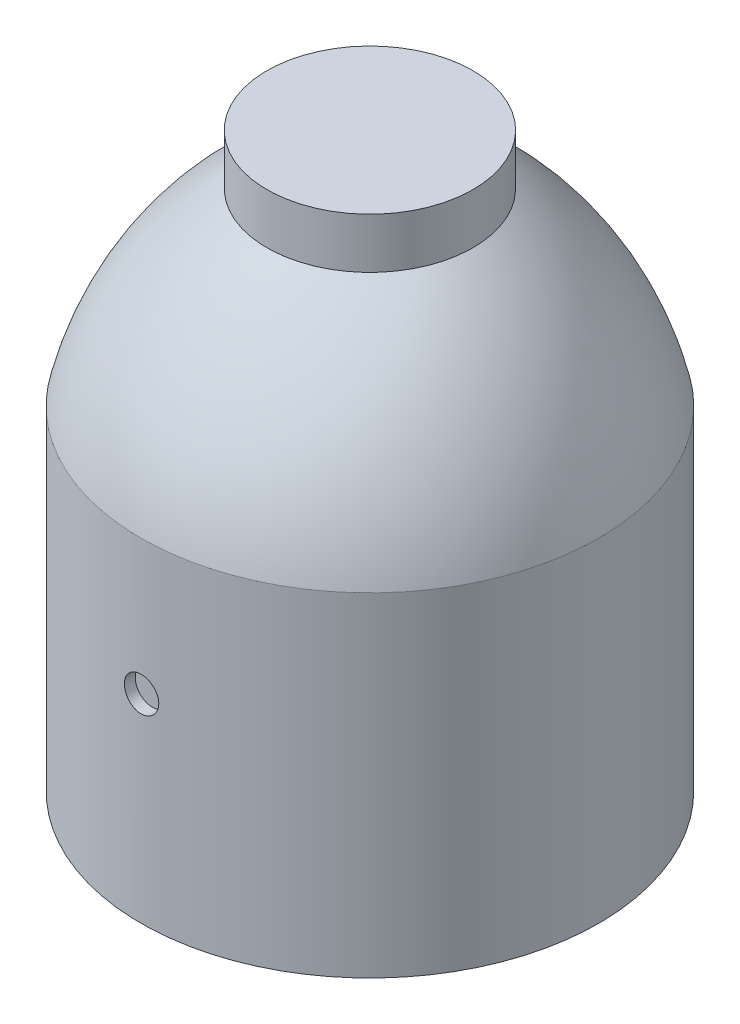
ISO-10303-21;
HEADER;
FILE_DESCRIPTION(('STEP AP214'),'2;1');
FILE_NAME('part.step','',(''),(''),'','','');
FILE_SCHEMA(('AUTOMOTIVE_DESIGN { 1 0 10303 214 1 1 1 1 }'));
ENDSEC;
DATA;
#1=APPLICATION_CONTEXT('core data for automotive mechanical design processes');
#2=APPLICATION_PROTOCOL_DEFINITION('international standard','automotive_design',2000,#1);
#3=PRODUCT_CONTEXT('',#1,'mechanical');
#4=PRODUCT('Part','Part','',(#3));
#5=PRODUCT_RELATED_PRODUCT_CATEGORY('part','',(#4));
#6=PRODUCT_DEFINITION_FORMATION('','',#4);
#7=PRODUCT_DEFINITION_CONTEXT('part definition',#1,'design');
#8=PRODUCT_DEFINITION('design','',#6,#7);
#9=PRODUCT_DEFINITION_SHAPE('','',#8);
#10=(LENGTH_UNIT() NAMED_UNIT(*) SI_UNIT(.MILLI.,.METRE.));
#11=(NAMED_UNIT(*) PLANE_ANGLE_UNIT() SI_UNIT($,.RADIAN.));
#12=(NAMED_UNIT(*) SI_UNIT($,.STERADIAN.) SOLID_ANGLE_UNIT());
#13=UNCERTAINTY_MEASURE_WITH_UNIT(LENGTH_MEASURE(1.E-05),#10,'distance_accuracy_value','');
#14=(GEOMETRIC_REPRESENTATION_CONTEXT(3) GLOBAL_UNCERTAINTY_ASSIGNED_CONTEXT((#13)) GLOBAL_UNIT_ASSIGNED_CONTEXT((#10,
#11,#12)) REPRESENTATION_CONTEXT('',''));
#15=CARTESIAN_POINT('',(0.,0.,0.));
#16=DIRECTION('',(0.,0.,1.));
#17=DIRECTION('',(1.,0.,0.));
#18=AXIS2_PLACEMENT_3D('',#15,#16,#17);
#19=CARTESIAN_POINT('',(7.83466695020169,43.9726716840758,0.));
#20=DIRECTION('',(0.,-1.,0.));
#21=DIRECTION('',(0.,0.,-1.));
#22=AXIS2_PLACEMENT_3D('',#19,#20,#21);
#23=PLANE('',#22);
#24=CARTESIAN_POINT('',(0.,43.9726716840758,0.));
#25=DIRECTION('',(0.,-1.,0.));
#26=DIRECTION('',(0.,0.,-1.));
#27=AXIS2_PLACEMENT_3D('',#24,#25,#26);
#28=CIRCLE('',#27,7.83466695020169);
#29=CARTESIAN_POINT('',(0.,43.9726716840758,-7.83466695020169));
#30=VERTEX_POINT('',#29);
#31=EDGE_CURVE('E43',#30,#30,#28,.T.);
#32=ORIENTED_EDGE('',*,*,#31,.T.);
#33=EDGE_LOOP('',(#32));
#34=FACE_BOUND('',#33,.T.);
#35=ADVANCED_FACE('F33',(#34),#23,.T.);
#36=CARTESIAN_POINT('',(0.,22.7406076347395,0.));
#37=DIRECTION('',(0.,-1.,0.));
#38=DIRECTION('',(0.,0.,-1.));
#39=AXIS2_PLACEMENT_3D('',#36,#37,#38);
#40=DEGENERATE_TOROIDAL_SURFACE('',#39,7.38748189935041,26.124975777846,.F.);
#41=CARTESIAN_POINT('',(0.,28.9042203905179,0.));
#42=DIRECTION('',(0.,-1.,0.));
#43=DIRECTION('',(0.,0.,-1.));
#44=AXIS2_PLACEMENT_3D('',#41,#42,#43);
#45=CIRCLE('',#44,18.);
#46=CARTESIAN_POINT('',(0.,28.9042203905179,-18.));
#47=VERTEX_POINT('',#46);
#48=EDGE_CURVE('E47',#47,#47,#45,.T.);
#49=ORIENTED_EDGE('',*,*,#48,.T.);
#50=EDGE_LOOP('',(#49));
#51=FACE_BOUND('',#50,.T.);
#52=ORIENTED_EDGE('',*,*,#31,.F.);
#53=EDGE_LOOP('',(#52));
#54=FACE_BOUND('',#53,.T.);
#55=ADVANCED_FACE('F87',(#51,#54),#40,.T.);
#56=CARTESIAN_POINT('',(0.,0.,0.));
#57=DIRECTION('',(0.,-1.,0.));
#58=DIRECTION('',(0.,0.,-1.));
#59=AXIS2_PLACEMENT_3D('',#56,#57,#58);
#60=CYLINDRICAL_SURFACE('',#59,18.);
#61=CARTESIAN_POINT('',(0.,0.,0.));
#62=DIRECTION('',(0.,-1.,0.));
#63=DIRECTION('',(0.,0.,-1.));
#64=AXIS2_PLACEMENT_3D('',#61,#62,#63);
#65=CIRCLE('',#64,18.);
#66=CARTESIAN_POINT('',(0.,0.,-18.));
#67=VERTEX_POINT('',#66);
#68=EDGE_CURVE('E51',#67,#67,#65,.T.);
#69=ORIENTED_EDGE('',*,*,#68,.T.);
#70=EDGE_LOOP('',(#69));
#71=FACE_BOUND('',#70,.T.);
#72=ORIENTED_EDGE('',*,*,#48,.F.);
#73=EDGE_LOOP('',(#72));
#74=FACE_BOUND('',#73,.T.);
#75=ADVANCED_FACE('F91',(#71,#74),#60,.F.);
#76=CARTESIAN_POINT('',(20.,0.,0.));
#77=DIRECTION('',(0.,-1.,0.));
#78=DIRECTION('',(0.,0.,-1.));
#79=AXIS2_PLACEMENT_3D('',#76,#77,#78);
#80=PLANE('',#79);
#81=CARTESIAN_POINT('',(0.,0.,0.));
#82=DIRECTION('',(0.,-1.,0.));
#83=DIRECTION('',(0.,0.,-1.));
#84=AXIS2_PLACEMENT_3D('',#81,#82,#83);
#85=CIRCLE('',#84,20.);
#86=CARTESIAN_POINT('',(0.,0.,-20.));
#87=VERTEX_POINT('',#86);
#88=EDGE_CURVE('E56',#87,#87,#85,.T.);
#89=ORIENTED_EDGE('',*,*,#88,.T.);
#90=EDGE_LOOP('',(#89));
#91=FACE_BOUND('',#90,.T.);
#92=ORIENTED_EDGE('',*,*,#68,.F.);
#93=EDGE_LOOP('',(#92));
#94=FACE_BOUND('',#93,.T.);
#95=ADVANCED_FACE('F96',(#91,#94),#80,.T.);
#96=CARTESIAN_POINT('',(0.,0.,0.));
#97=DIRECTION('',(0.,-1.,0.));
#98=DIRECTION('',(0.,0.,-1.));
#99=AXIS2_PLACEMENT_3D('',#96,#97,#98);
#100=CYLINDRICAL_SURFACE('',#99,20.);
#101=CARTESIAN_POINT('',(1.5,17.3473663975393,19.9436706751791));
#102=CARTESIAN_POINT('',(1.49999631284401,17.4314948318172,19.9436714247109));
#103=CARTESIAN_POINT('',(1.49289860739439,17.5156812493339,19.9442087219975));
#104=CARTESIAN_POINT('',(1.46468784137981,17.6817268131872,19.9462999542358));
#105=CARTESIAN_POINT('',(1.44355871231829,17.7635831789873,19.9478550547254));
#106=CARTESIAN_POINT('',(1.38789779324919,17.9225395809697,19.9518047691616));
#107=CARTESIAN_POINT('',(1.3533733740953,17.9996422059385,19.9541989213442));
#108=CARTESIAN_POINT('',(1.27191450979852,18.1469389029969,19.9595563959789));
#109=CARTESIAN_POINT('',(1.22498279950199,18.2171344928796,19.9625195929615));
#110=CARTESIAN_POINT('',(1.11993432781423,18.348791421323,19.9686882981736));
#111=CARTESIAN_POINT('',(1.06179688800529,18.4102362414351,19.9718942476191));
#112=CARTESIAN_POINT('',(0.93603067250677,18.522505722187,19.9781831621206));
#113=CARTESIAN_POINT('',(0.868401490593041,18.5733299280579,19.9812661219056));
#114=CARTESIAN_POINT('',(0.725474871268799,18.662968949624,19.9869657395593));
#115=CARTESIAN_POINT('',(0.650168585461499,18.7017696946339,19.9895818495818));
#116=CARTESIAN_POINT('',(0.49408728515665,18.7661703596598,19.9940482820627));
#117=CARTESIAN_POINT('',(0.413312350227829,18.791770471698,19.9958986156604));
#118=CARTESIAN_POINT('',(0.24874925036704,18.8289962368438,19.9986219399733));
#119=CARTESIAN_POINT('',(0.164967095353705,18.8406483205173,19.9994967789682));
#120=CARTESIAN_POINT('',(-0.00336809130426481,18.8497289397635,20.0001767917244));
#121=CARTESIAN_POINT('',(-0.0879211110423922,18.8471576946544,19.9999819819791));
#122=CARTESIAN_POINT('',(-0.255218748149912,18.8278863366852,19.9985461791421));
#123=CARTESIAN_POINT('',(-0.337966660410974,18.8112146486972,19.9973072908106));
#124=CARTESIAN_POINT('',(-0.499486291412522,18.7642598136409,19.9939251552444));
#125=CARTESIAN_POINT('',(-0.578257978464621,18.7339765581147,19.9917819008036));
#126=CARTESIAN_POINT('',(-0.72967992384892,18.660626317356,19.9868286111045));
#127=CARTESIAN_POINT('',(-0.802323960991477,18.6175465361483,19.9840179089941));
#128=CARTESIAN_POINT('',(-0.939360594503045,18.5198354169471,19.978045787876));
#129=CARTESIAN_POINT('',(-1.00375305579813,18.4652038898962,19.9748843631288));
#130=CARTESIAN_POINT('',(-1.12262474222923,18.3457797178819,19.9685571200843));
#131=CARTESIAN_POINT('',(-1.17707916883749,18.2809623856234,19.9653913101349));
#132=CARTESIAN_POINT('',(-1.27433760665748,18.1430927602105,19.959419970567));
#133=CARTESIAN_POINT('',(-1.31714161069999,18.0700404619887,19.9566144411701));
#134=CARTESIAN_POINT('',(-1.38988285490415,17.9177578931645,19.9516806682916));
#135=CARTESIAN_POINT('',(-1.4198189134728,17.8385270560096,19.9495524870119));
#136=CARTESIAN_POINT('',(-1.46595667179795,17.67614431693,19.9462154499794));
#137=CARTESIAN_POINT('',(-1.48215860485201,17.5929924816355,19.9450065786106));
#138=CARTESIAN_POINT('',(-1.50033702209464,17.4253448206318,19.9436474451507));
#139=CARTESIAN_POINT('',(-1.50234804014615,17.3408527594478,19.9434946131863));
#140=CARTESIAN_POINT('',(-1.49217790233958,17.1727326376888,19.9442580734706));
#141=CARTESIAN_POINT('',(-1.47999685337437,17.0891045706112,19.9451743576668));
#142=CARTESIAN_POINT('',(-1.44181710169969,16.925184824183,19.9479704572233));
#143=CARTESIAN_POINT('',(-1.41583442327885,16.8448893918236,19.9498491550899));
#144=CARTESIAN_POINT('',(-1.35080522878804,16.6897981301655,19.9543574532934));
#145=CARTESIAN_POINT('',(-1.31175854243361,16.6150023725686,19.9569870634181));
#146=CARTESIAN_POINT('',(-1.2216219631562,16.472875344982,19.9627071136634));
#147=CARTESIAN_POINT('',(-1.17050900238948,16.4055587404373,19.9657984322502));
#148=CARTESIAN_POINT('',(-1.05772421033485,16.2804488992959,19.9720905549617));
#149=CARTESIAN_POINT('',(-0.996052231484174,16.2226557958127,19.975291360616));
#150=CARTESIAN_POINT('',(-0.863751071664403,16.1181161454315,19.9814493930731));
#151=CARTESIAN_POINT('',(-0.793104165808337,16.0713919968453,19.9844061182321));
#152=CARTESIAN_POINT('',(-0.644947221990192,15.9904700824454,19.9897356262579));
#153=CARTESIAN_POINT('',(-0.56743724133021,15.9562722120579,19.9921084139996));
#154=CARTESIAN_POINT('',(-0.407835533992325,15.9014122891843,19.9960003563777));
#155=CARTESIAN_POINT('',(-0.325748638943226,15.8807362453301,19.9975203931443));
#156=CARTESIAN_POINT('',(-0.159256592820331,15.8534611378392,19.9995391228448));
#157=CARTESIAN_POINT('',(-0.0748514764856431,15.8468618633752,20.0000378310751));
#158=CARTESIAN_POINT('',(0.0936599022297128,15.8479298847501,19.9999577474694));
#159=CARTESIAN_POINT('',(0.177766389716277,15.8555622121031,19.999381596669));
#160=CARTESIAN_POINT('',(0.343499701494934,15.8848040413708,19.9972217798986));
#161=CARTESIAN_POINT('',(0.42512652193554,15.9064135649942,19.9956381123638));
#162=CARTESIAN_POINT('',(0.583586891968922,15.9629878780826,19.9916410805027));
#163=CARTESIAN_POINT('',(0.660420597981289,15.9979522314576,19.989227743269));
#164=CARTESIAN_POINT('',(0.807132637033066,16.0802394302928,19.9838417849228));
#165=CARTESIAN_POINT('',(0.877011110424922,16.1275620263011,19.9808691750997));
#166=CARTESIAN_POINT('',(1.0080076253239,16.2333532082976,19.9746899428358));
#167=CARTESIAN_POINT('',(1.0691048813846,16.2918475006511,19.9714827914222));
#168=CARTESIAN_POINT('',(1.18063663968307,16.4182787620678,19.9652003844937));
#169=CARTESIAN_POINT('',(1.23106854462047,16.4862180245749,19.9621251612519));
#170=CARTESIAN_POINT('',(1.3198926494262,16.6297187058213,19.9564494251809));
#171=CARTESIAN_POINT('',(1.35826551818871,16.7052921087428,19.9538496773175));
#172=CARTESIAN_POINT('',(1.42172936312997,16.861775626475,19.9494287405787));
#173=CARTESIAN_POINT('',(1.44683573384081,16.9426794326416,19.9476066497794));
#174=CARTESIAN_POINT('',(1.47660249533122,17.0779513826942,19.9454198272495));
#175=CARTESIAN_POINT('',(1.48536503492031,17.1314475275407,19.9447668737592));
#176=CARTESIAN_POINT('',(1.49706496792379,17.2390765721958,19.9438920569245));
#177=CARTESIAN_POINT('',(1.50000237357368,17.2932094706668,19.9436701926747));
#178=CARTESIAN_POINT('',(1.5,17.3473663975393,19.9436706751791));
#179=B_SPLINE_CURVE_WITH_KNOTS('',3,(#101,#102,#103,#104,#105,#106,#107,#108,#109,#110,#111,
#112,#113,#114,#115,#116,#117,#118,#119,#120,#121,#122,#123,#124,#125,#126,#127,#128,#129,#130,
#131,#132,#133,#134,#135,#136,#137,#138,#139,#140,#141,#142,#143,#144,#145,#146,#147,#148,#149,
#150,#151,#152,#153,#154,#155,#156,#157,#158,#159,#160,#161,#162,#163,#164,#165,#166,#167,#168,
#169,#170,#171,#172,#173,#174,#175,#176,#177,#178),.UNSPECIFIED.,.T.,.F.,(4,2,2,2,2,2,2,2,2,2,2,
2,2,2,2,2,2,2,2,2,2,2,2,2,2,2,2,2,2,2,2,2,2,2,2,2,2,2,4),(0.,0.252187579339044,
0.504664457860796,0.757002605762189,1.00928517896143,1.26203783609002,1.5148013137358,
1.76785948521025,2.02091397548468,2.2734881817416,2.52605849341277,2.7781208625958,
3.03018524026398,3.28250252487075,3.53482393925043,3.7877666140638,4.04070944452772,
4.2936754963882,4.54663725110237,4.79898320559482,5.0513272594613,5.30337896930957,
5.55543396468601,5.80797478825659,6.06051914138529,6.31357024084872,6.5666192277034,
6.8194059624945,7.07218891127966,7.32435156508922,7.57651461054472,7.82866942254426,
8.08081914517807,8.3335562178414,8.58635476809665,8.83955652118654,9.09246380844972,
9.25480764733516,9.41715114522215),.UNSPECIFIED.);
#180=CARTESIAN_POINT('',(1.5,17.3473663975393,19.9436706751791));
#181=VERTEX_POINT('',#180);
#182=EDGE_CURVE('E10',#181,#181,#179,.T.);
#183=ORIENTED_EDGE('',*,*,#182,.F.);
#184=EDGE_LOOP('',(#183));
#185=FACE_BOUND('',#184,.T.);
#186=CARTESIAN_POINT('',(0.,29.1390525799724,0.));
#187=DIRECTION('',(0.,-1.,0.));
#188=DIRECTION('',(0.,0.,-1.));
#189=AXIS2_PLACEMENT_3D('',#186,#187,#188);
#190=CIRCLE('',#189,20.);
#191=CARTESIAN_POINT('',(0.,29.1390525799724,-20.));
#192=VERTEX_POINT('',#191);
#193=EDGE_CURVE('E59',#192,#192,#190,.T.);
#194=ORIENTED_EDGE('',*,*,#193,.T.);
#195=EDGE_LOOP('',(#194));
#196=FACE_BOUND('',#195,.T.);
#197=ORIENTED_EDGE('',*,*,#88,.F.);
#198=EDGE_LOOP('',(#197));
#199=FACE_BOUND('',#198,.T.);
#200=ADVANCED_FACE('F102',(#185,#196,#199),#100,.T.);
#201=CARTESIAN_POINT('',(0.,22.7406076347395,0.));
#202=DIRECTION('',(0.,-1.,0.));
#203=DIRECTION('',(0.,0.,-1.));
#204=AXIS2_PLACEMENT_3D('',#201,#202,#203);
#205=DEGENERATE_TOROIDAL_SURFACE('',#204,7.38748189935041,28.124975777846,.F.);
#206=CARTESIAN_POINT('',(0.,45.5980943623499,0.));
#207=DIRECTION('',(0.,-1.,0.));
#208=DIRECTION('',(0.,0.,-1.));
#209=AXIS2_PLACEMENT_3D('',#206,#207,#208);
#210=CIRCLE('',#209,9.);
#211=CARTESIAN_POINT('',(0.,45.5980943623499,-9.));
#212=VERTEX_POINT('',#211);
#213=EDGE_CURVE('E62',#212,#212,#210,.T.);
#214=ORIENTED_EDGE('',*,*,#213,.T.);
#215=EDGE_LOOP('',(#214));
#216=FACE_BOUND('',#215,.T.);
#217=ORIENTED_EDGE('',*,*,#193,.F.);
#218=EDGE_LOOP('',(#217));
#219=FACE_BOUND('',#218,.T.);
#220=ADVANCED_FACE('F107',(#216,#219),#205,.F.);
#221=CARTESIAN_POINT('',(0.,0.,0.));
#222=DIRECTION('',(0.,-1.,0.));
#223=DIRECTION('',(0.,0.,-1.));
#224=AXIS2_PLACEMENT_3D('',#221,#222,#223);
#225=CYLINDRICAL_SURFACE('',#224,9.);
#226=CARTESIAN_POINT('',(0.,50.,0.));
#227=DIRECTION('',(0.,-1.,0.));
#228=DIRECTION('',(0.,0.,-1.));
#229=AXIS2_PLACEMENT_3D('',#226,#227,#228);
#230=CIRCLE('',#229,9.);
#231=CARTESIAN_POINT('',(0.,50.,-9.));
#232=VERTEX_POINT('',#231);
#233=EDGE_CURVE('E65',#232,#232,#230,.T.);
#234=ORIENTED_EDGE('',*,*,#233,.T.);
#235=EDGE_LOOP('',(#234));
#236=FACE_BOUND('',#235,.T.);
#237=ORIENTED_EDGE('',*,*,#213,.F.);
#238=EDGE_LOOP('',(#237));
#239=FACE_BOUND('',#238,.T.);
#240=ADVANCED_FACE('F82',(#236,#239),#225,.T.);
#241=CARTESIAN_POINT('',(9.,50.,0.));
#242=DIRECTION('',(0.,1.,0.));
#243=DIRECTION('',(0.,0.,1.));
#244=AXIS2_PLACEMENT_3D('',#241,#242,#243);
#245=PLANE('',#244);
#246=ORIENTED_EDGE('',*,*,#233,.F.);
#247=EDGE_LOOP('',(#246));
#248=FACE_BOUND('',#247,.T.);
#249=ADVANCED_FACE('F76',(#248),#245,.T.);
#250=CARTESIAN_POINT('',(0.,17.3473663975393,19.));
#251=DIRECTION('',(0.,0.,1.));
#252=DIRECTION('',(1.,0.,0.));
#253=AXIS2_PLACEMENT_3D('',#250,#251,#252);
#254=CYLINDRICAL_SURFACE('',#253,1.5);
#255=ORIENTED_EDGE('',*,*,#182,.T.);
#256=EDGE_LOOP('',(#255));
#257=FACE_BOUND('',#256,.T.);
#258=CARTESIAN_POINT('',(0.,17.3473663975393,19.));
#259=DIRECTION('',(0.,0.,1.));
#260=DIRECTION('',(1.,0.,0.));
#261=AXIS2_PLACEMENT_3D('',#258,#259,#260);
#262=CIRCLE('',#261,1.5);
#263=CARTESIAN_POINT('',(1.5,17.3473663975393,19.));
#264=VERTEX_POINT('',#263);
#265=EDGE_CURVE('E68',#264,#264,#262,.T.);
#266=ORIENTED_EDGE('',*,*,#265,.F.);
#267=EDGE_LOOP('',(#266));
#268=FACE_BOUND('',#267,.T.);
#269=ADVANCED_FACE('F74',(#257,#268),#254,.F.);
#270=CARTESIAN_POINT('',(0.,17.3473663975393,19.));
#271=DIRECTION('',(0.,0.,1.));
#272=DIRECTION('',(1.,0.,0.));
#273=AXIS2_PLACEMENT_3D('',#270,#271,#272);
#274=PLANE('',#273);
#275=ORIENTED_EDGE('',*,*,#265,.T.);
#276=EDGE_LOOP('',(#275));
#277=FACE_BOUND('',#276,.T.);
#278=ADVANCED_FACE('F72',(#277),#274,.T.);
#279=CLOSED_SHELL('',(#35,#55,#75,#95,#200,#220,#240,#249,#269,#278));
#280=MANIFOLD_SOLID_BREP('B2',#279);
#281=ADVANCED_BREP_SHAPE_REPRESENTATION('',(#18,#280),#14);
#282=SHAPE_DEFINITION_REPRESENTATION(#9,#281);
ENDSEC;
END-ISO-10303-21;
